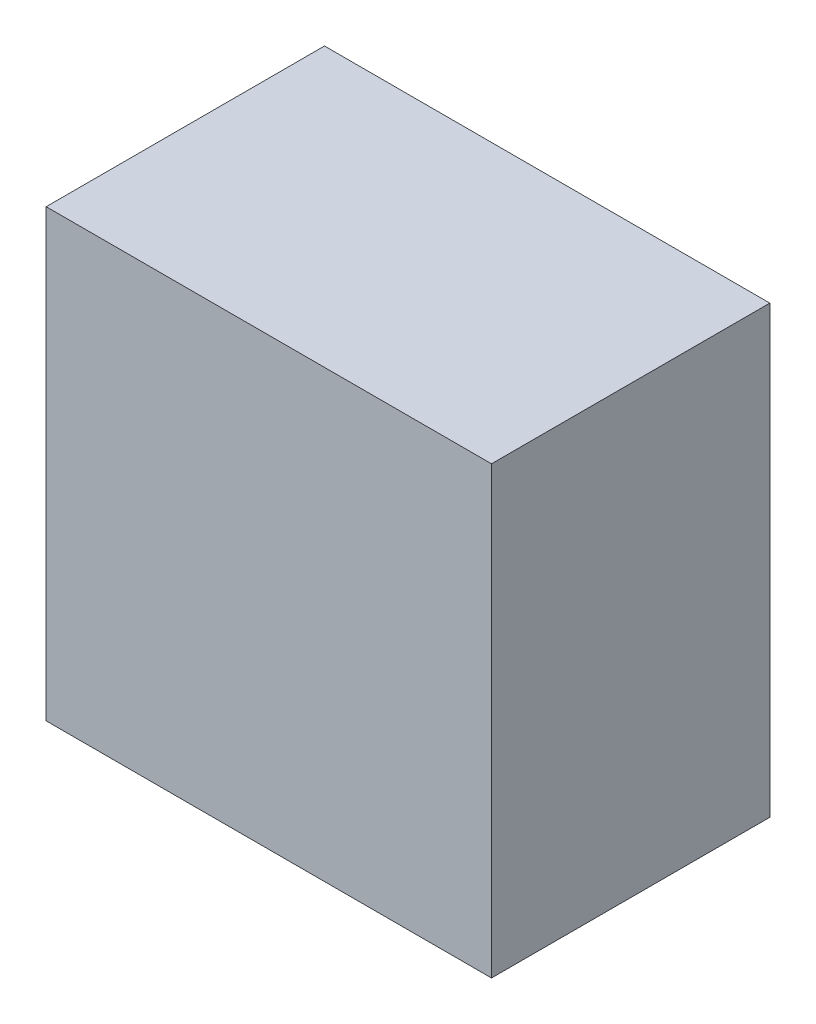
ISO-10303-21;
HEADER;
FILE_DESCRIPTION(('STEP AP214'),'2;1');
FILE_NAME('part.step','',(''),(''),'','','');
FILE_SCHEMA(('AUTOMOTIVE_DESIGN { 1 0 10303 214 1 1 1 1 }'));
ENDSEC;
DATA;
#1=APPLICATION_CONTEXT('core data for automotive mechanical design processes');
#2=APPLICATION_PROTOCOL_DEFINITION('international standard','automotive_design',2000,#1);
#3=PRODUCT_CONTEXT('',#1,'mechanical');
#4=PRODUCT('Part','Part','',(#3));
#5=PRODUCT_RELATED_PRODUCT_CATEGORY('part','',(#4));
#6=PRODUCT_DEFINITION_FORMATION('','',#4);
#7=PRODUCT_DEFINITION_CONTEXT('part definition',#1,'design');
#8=PRODUCT_DEFINITION('design','',#6,#7);
#9=PRODUCT_DEFINITION_SHAPE('','',#8);
#10=(LENGTH_UNIT() NAMED_UNIT(*) SI_UNIT(.MILLI.,.METRE.));
#11=(NAMED_UNIT(*) PLANE_ANGLE_UNIT() SI_UNIT($,.RADIAN.));
#12=(NAMED_UNIT(*) SI_UNIT($,.STERADIAN.) SOLID_ANGLE_UNIT());
#13=UNCERTAINTY_MEASURE_WITH_UNIT(LENGTH_MEASURE(1.E-05),#10,'distance_accuracy_value','');
#14=(GEOMETRIC_REPRESENTATION_CONTEXT(3) GLOBAL_UNCERTAINTY_ASSIGNED_CONTEXT((#13)) GLOBAL_UNIT_ASSIGNED_CONTEXT((#10,
#11,#12)) REPRESENTATION_CONTEXT('',''));
#15=CARTESIAN_POINT('',(0.,0.,0.));
#16=DIRECTION('',(0.,0.,1.));
#17=DIRECTION('',(1.,0.,0.));
#18=AXIS2_PLACEMENT_3D('',#15,#16,#17);
#19=CARTESIAN_POINT('',(0.,0.,5.));
#20=DIRECTION('',(1.,0.,0.));
#21=DIRECTION('',(0.,0.,-1.));
#22=AXIS2_PLACEMENT_3D('',#19,#20,#21);
#23=PLANE('',#22);
#24=DIRECTION('',(0.,-1.,0.));
#25=VECTOR('',#24,1.);
#26=CARTESIAN_POINT('',(0.,0.,0.));
#27=LINE('',#26,#25);
#28=CARTESIAN_POINT('',(0.,8.,0.));
#29=VERTEX_POINT('',#28);
#30=CARTESIAN_POINT('',(0.,0.,0.));
#31=VERTEX_POINT('',#30);
#32=EDGE_CURVE('E108',#29,#31,#27,.T.);
#33=ORIENTED_EDGE('',*,*,#32,.T.);
#34=DIRECTION('',(0.,0.,-1.));
#35=VECTOR('',#34,1.);
#36=CARTESIAN_POINT('',(0.,0.,5.));
#37=LINE('',#36,#35);
#38=CARTESIAN_POINT('',(0.,0.,5.));
#39=VERTEX_POINT('',#38);
#40=EDGE_CURVE('E11',#39,#31,#37,.T.);
#41=ORIENTED_EDGE('',*,*,#40,.F.);
#42=DIRECTION('',(0.,-1.,0.));
#43=VECTOR('',#42,1.);
#44=CARTESIAN_POINT('',(0.,0.,5.));
#45=LINE('',#44,#43);
#46=CARTESIAN_POINT('',(0.,8.,5.));
#47=VERTEX_POINT('',#46);
#48=EDGE_CURVE('E92',#47,#39,#45,.T.);
#49=ORIENTED_EDGE('',*,*,#48,.F.);
#50=DIRECTION('',(0.,0.,-1.));
#51=VECTOR('',#50,1.);
#52=CARTESIAN_POINT('',(0.,8.,5.));
#53=LINE('',#52,#51);
#54=EDGE_CURVE('E105',#47,#29,#53,.T.);
#55=ORIENTED_EDGE('',*,*,#54,.T.);
#56=EDGE_LOOP('',(#33,#41,#49,#55));
#57=FACE_BOUND('',#56,.T.);
#58=ADVANCED_FACE('F43',(#57),#23,.F.);
#59=CARTESIAN_POINT('',(0.,0.,5.));
#60=DIRECTION('',(0.,1.,0.));
#61=DIRECTION('',(0.,0.,1.));
#62=AXIS2_PLACEMENT_3D('',#59,#60,#61);
#63=PLANE('',#62);
#64=DIRECTION('',(1.,0.,0.));
#65=VECTOR('',#64,1.);
#66=CARTESIAN_POINT('',(0.,0.,0.));
#67=LINE('',#66,#65);
#68=CARTESIAN_POINT('',(8.,0.,0.));
#69=VERTEX_POINT('',#68);
#70=EDGE_CURVE('E97',#31,#69,#67,.T.);
#71=ORIENTED_EDGE('',*,*,#70,.T.);
#72=DIRECTION('',(0.,0.,-1.));
#73=VECTOR('',#72,1.);
#74=CARTESIAN_POINT('',(8.,0.,5.));
#75=LINE('',#74,#73);
#76=CARTESIAN_POINT('',(8.,0.,5.));
#77=VERTEX_POINT('',#76);
#78=EDGE_CURVE('E51',#77,#69,#75,.T.);
#79=ORIENTED_EDGE('',*,*,#78,.F.);
#80=DIRECTION('',(1.,0.,0.));
#81=VECTOR('',#80,1.);
#82=CARTESIAN_POINT('',(0.,0.,5.));
#83=LINE('',#82,#81);
#84=EDGE_CURVE('E87',#39,#77,#83,.T.);
#85=ORIENTED_EDGE('',*,*,#84,.F.);
#86=ORIENTED_EDGE('',*,*,#40,.T.);
#87=EDGE_LOOP('',(#71,#79,#85,#86));
#88=FACE_BOUND('',#87,.T.);
#89=ADVANCED_FACE('F100',(#88),#63,.F.);
#90=CARTESIAN_POINT('',(8.,0.,5.));
#91=DIRECTION('',(-1.,0.,0.));
#92=DIRECTION('',(0.,0.,1.));
#93=AXIS2_PLACEMENT_3D('',#90,#91,#92);
#94=PLANE('',#93);
#95=DIRECTION('',(0.,1.,0.));
#96=VECTOR('',#95,1.);
#97=CARTESIAN_POINT('',(8.,0.,0.));
#98=LINE('',#97,#96);
#99=CARTESIAN_POINT('',(8.,8.,0.));
#100=VERTEX_POINT('',#99);
#101=EDGE_CURVE('E78',#69,#100,#98,.T.);
#102=ORIENTED_EDGE('',*,*,#101,.T.);
#103=DIRECTION('',(0.,0.,-1.));
#104=VECTOR('',#103,1.);
#105=CARTESIAN_POINT('',(8.,8.,5.));
#106=LINE('',#105,#104);
#107=CARTESIAN_POINT('',(8.,8.,5.));
#108=VERTEX_POINT('',#107);
#109=EDGE_CURVE('E98',#108,#100,#106,.T.);
#110=ORIENTED_EDGE('',*,*,#109,.F.);
#111=DIRECTION('',(0.,1.,0.));
#112=VECTOR('',#111,1.);
#113=CARTESIAN_POINT('',(8.,0.,5.));
#114=LINE('',#113,#112);
#115=EDGE_CURVE('E95',#77,#108,#114,.T.);
#116=ORIENTED_EDGE('',*,*,#115,.F.);
#117=ORIENTED_EDGE('',*,*,#78,.T.);
#118=EDGE_LOOP('',(#102,#110,#116,#117));
#119=FACE_BOUND('',#118,.T.);
#120=ADVANCED_FACE('F99',(#119),#94,.F.);
#121=CARTESIAN_POINT('',(0.,8.,5.));
#122=DIRECTION('',(0.,-1.,0.));
#123=DIRECTION('',(0.,0.,-1.));
#124=AXIS2_PLACEMENT_3D('',#121,#122,#123);
#125=PLANE('',#124);
#126=DIRECTION('',(-1.,0.,0.));
#127=VECTOR('',#126,1.);
#128=CARTESIAN_POINT('',(0.,8.,0.));
#129=LINE('',#128,#127);
#130=EDGE_CURVE('E85',#100,#29,#129,.T.);
#131=ORIENTED_EDGE('',*,*,#130,.T.);
#132=ORIENTED_EDGE('',*,*,#54,.F.);
#133=DIRECTION('',(-1.,0.,0.));
#134=VECTOR('',#133,1.);
#135=CARTESIAN_POINT('',(0.,8.,5.));
#136=LINE('',#135,#134);
#137=EDGE_CURVE('E56',#108,#47,#136,.T.);
#138=ORIENTED_EDGE('',*,*,#137,.F.);
#139=ORIENTED_EDGE('',*,*,#109,.T.);
#140=EDGE_LOOP('',(#131,#132,#138,#139));
#141=FACE_BOUND('',#140,.T.);
#142=ADVANCED_FACE('F111',(#141),#125,.F.);
#143=CARTESIAN_POINT('',(0.,0.,5.));
#144=DIRECTION('',(0.,0.,-1.));
#145=DIRECTION('',(-1.,0.,0.));
#146=AXIS2_PLACEMENT_3D('',#143,#144,#145);
#147=PLANE('',#146);
#148=ORIENTED_EDGE('',*,*,#48,.T.);
#149=ORIENTED_EDGE('',*,*,#84,.T.);
#150=ORIENTED_EDGE('',*,*,#115,.T.);
#151=ORIENTED_EDGE('',*,*,#137,.T.);
#152=EDGE_LOOP('',(#148,#149,#150,#151));
#153=FACE_BOUND('',#152,.T.);
#154=ADVANCED_FACE('F89',(#153),#147,.F.);
#155=CARTESIAN_POINT('',(0.,0.,0.));
#156=DIRECTION('',(0.,0.,-1.));
#157=DIRECTION('',(-1.,0.,0.));
#158=AXIS2_PLACEMENT_3D('',#155,#156,#157);
#159=PLANE('',#158);
#160=ORIENTED_EDGE('',*,*,#32,.F.);
#161=ORIENTED_EDGE('',*,*,#130,.F.);
#162=ORIENTED_EDGE('',*,*,#101,.F.);
#163=ORIENTED_EDGE('',*,*,#70,.F.);
#164=EDGE_LOOP('',(#160,#161,#162,#163));
#165=FACE_BOUND('',#164,.T.);
#166=ADVANCED_FACE('F118',(#165),#159,.T.);
#167=CLOSED_SHELL('',(#58,#89,#120,#142,#154,#166));
#168=MANIFOLD_SOLID_BREP('B2',#167);
#169=ADVANCED_BREP_SHAPE_REPRESENTATION('',(#18,#168),#14);
#170=SHAPE_DEFINITION_REPRESENTATION(#9,#169);
ENDSEC;
END-ISO-10303-21;
